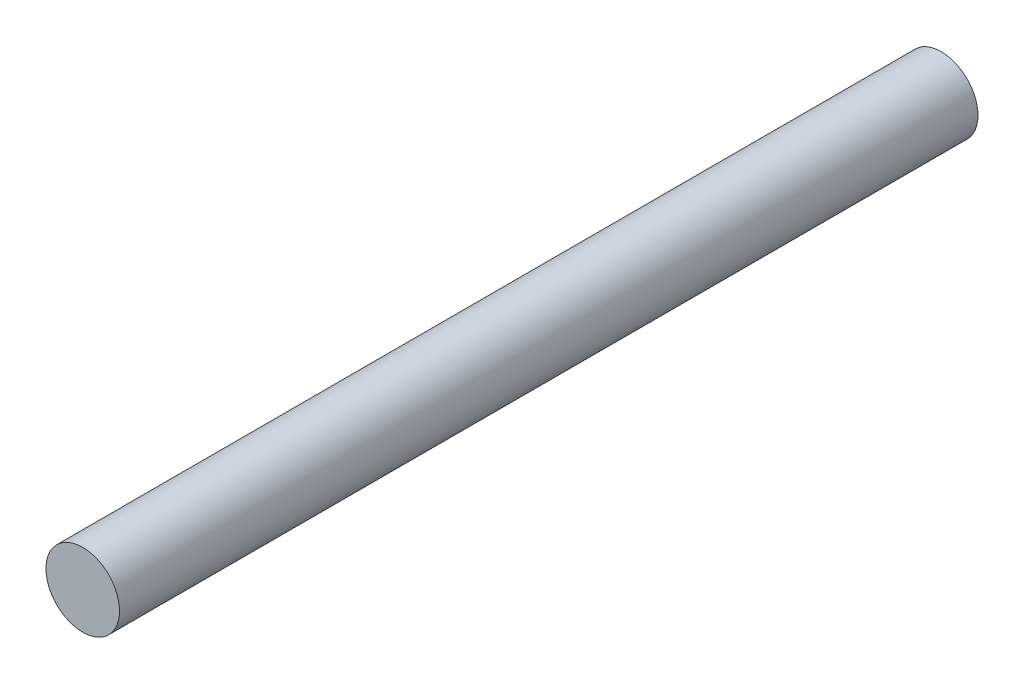
ISO-10303-21;
HEADER;
FILE_DESCRIPTION(('STEP AP214'),'2;1');
FILE_NAME('part.step','',(''),(''),'','','');
FILE_SCHEMA(('AUTOMOTIVE_DESIGN { 1 0 10303 214 1 1 1 1 }'));
ENDSEC;
DATA;
#1=APPLICATION_CONTEXT('core data for automotive mechanical design processes');
#2=APPLICATION_PROTOCOL_DEFINITION('international standard','automotive_design',2000,#1);
#3=PRODUCT_CONTEXT('',#1,'mechanical');
#4=PRODUCT('Part','Part','',(#3));
#5=PRODUCT_RELATED_PRODUCT_CATEGORY('part','',(#4));
#6=PRODUCT_DEFINITION_FORMATION('','',#4);
#7=PRODUCT_DEFINITION_CONTEXT('part definition',#1,'design');
#8=PRODUCT_DEFINITION('design','',#6,#7);
#9=PRODUCT_DEFINITION_SHAPE('','',#8);
#10=(LENGTH_UNIT() NAMED_UNIT(*) SI_UNIT(.MILLI.,.METRE.));
#11=(NAMED_UNIT(*) PLANE_ANGLE_UNIT() SI_UNIT($,.RADIAN.));
#12=(NAMED_UNIT(*) SI_UNIT($,.STERADIAN.) SOLID_ANGLE_UNIT());
#13=UNCERTAINTY_MEASURE_WITH_UNIT(LENGTH_MEASURE(1.E-05),#10,'distance_accuracy_value','');
#14=(GEOMETRIC_REPRESENTATION_CONTEXT(3) GLOBAL_UNCERTAINTY_ASSIGNED_CONTEXT((#13)) GLOBAL_UNIT_ASSIGNED_CONTEXT((#10,
#11,#12)) REPRESENTATION_CONTEXT('',''));
#15=CARTESIAN_POINT('',(0.,0.,0.));
#16=DIRECTION('',(0.,0.,1.));
#17=DIRECTION('',(1.,0.,0.));
#18=AXIS2_PLACEMENT_3D('',#15,#16,#17);
#19=CARTESIAN_POINT('',(0.,0.,70.));
#20=DIRECTION('',(0.,0.,-1.));
#21=DIRECTION('',(-1.,0.,0.));
#22=AXIS2_PLACEMENT_3D('',#19,#20,#21);
#23=CYLINDRICAL_SURFACE('',#22,3.);
#24=CARTESIAN_POINT('',(0.,0.,70.));
#25=DIRECTION('',(0.,0.,1.));
#26=DIRECTION('',(1.,0.,0.));
#27=AXIS2_PLACEMENT_3D('',#24,#25,#26);
#28=CIRCLE('',#27,3.);
#29=CARTESIAN_POINT('',(3.,0.,70.));
#30=VERTEX_POINT('',#29);
#31=EDGE_CURVE('E10',#30,#30,#28,.T.);
#32=ORIENTED_EDGE('',*,*,#31,.F.);
#33=EDGE_LOOP('',(#32));
#34=FACE_BOUND('',#33,.T.);
#35=CARTESIAN_POINT('',(0.,0.,0.));
#36=DIRECTION('',(0.,0.,1.));
#37=DIRECTION('',(1.,0.,0.));
#38=AXIS2_PLACEMENT_3D('',#35,#36,#37);
#39=CIRCLE('',#38,3.);
#40=CARTESIAN_POINT('',(3.,0.,0.));
#41=VERTEX_POINT('',#40);
#42=EDGE_CURVE('E46',#41,#41,#39,.T.);
#43=ORIENTED_EDGE('',*,*,#42,.T.);
#44=EDGE_LOOP('',(#43));
#45=FACE_BOUND('',#44,.T.);
#46=ADVANCED_FACE('F43',(#34,#45),#23,.T.);
#47=CARTESIAN_POINT('',(0.,0.,70.));
#48=DIRECTION('',(0.,0.,1.));
#49=DIRECTION('',(1.,0.,0.));
#50=AXIS2_PLACEMENT_3D('',#47,#48,#49);
#51=PLANE('',#50);
#52=ORIENTED_EDGE('',*,*,#31,.T.);
#53=EDGE_LOOP('',(#52));
#54=FACE_BOUND('',#53,.T.);
#55=ADVANCED_FACE('F60',(#54),#51,.T.);
#56=CARTESIAN_POINT('',(0.,0.,0.));
#57=DIRECTION('',(0.,0.,1.));
#58=DIRECTION('',(1.,0.,0.));
#59=AXIS2_PLACEMENT_3D('',#56,#57,#58);
#60=PLANE('',#59);
#61=ORIENTED_EDGE('',*,*,#42,.F.);
#62=EDGE_LOOP('',(#61));
#63=FACE_BOUND('',#62,.T.);
#64=ADVANCED_FACE('F58',(#63),#60,.F.);
#65=CLOSED_SHELL('',(#46,#55,#64));
#66=MANIFOLD_SOLID_BREP('B2',#65);
#67=ADVANCED_BREP_SHAPE_REPRESENTATION('',(#18,#66),#14);
#68=SHAPE_DEFINITION_REPRESENTATION(#9,#67);
ENDSEC;
END-ISO-10303-21;
